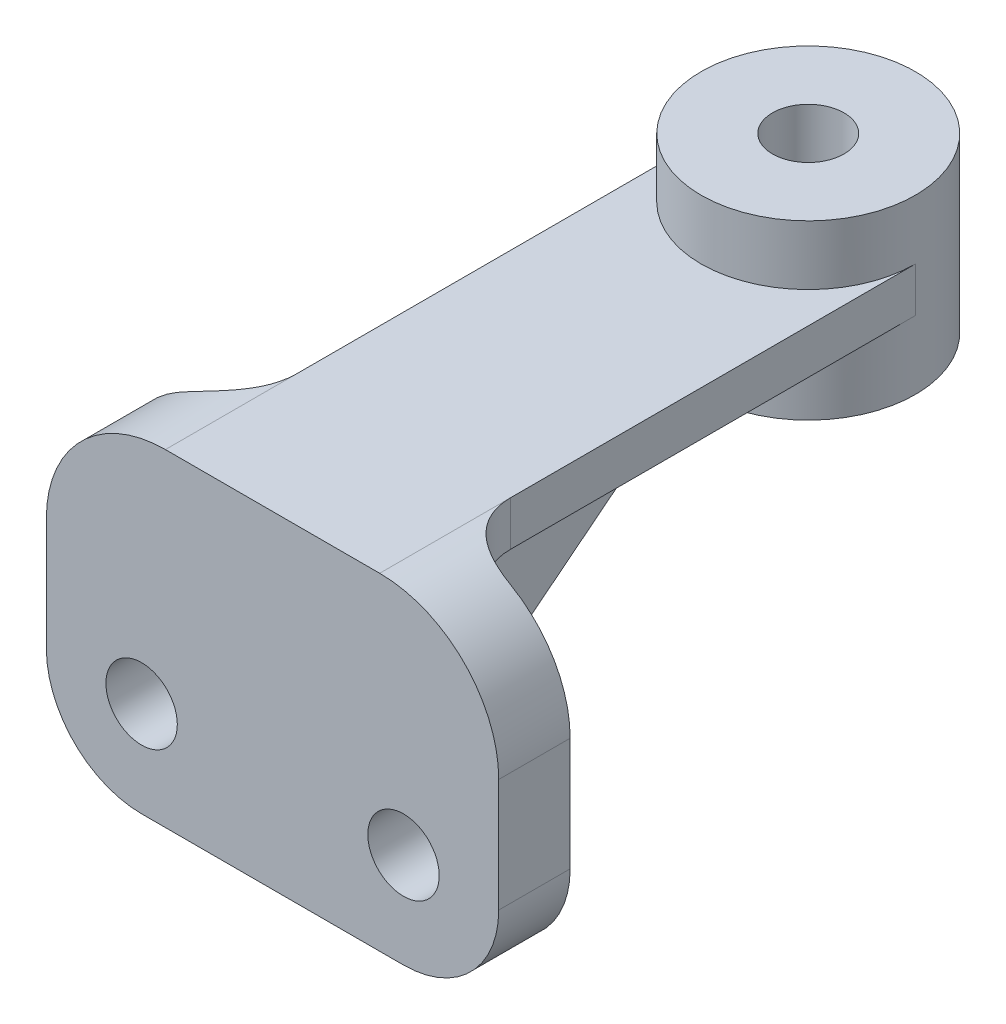
ISO-10303-21;
HEADER;
FILE_DESCRIPTION(('STEP AP214'),'2;1');
FILE_NAME('part.step','',(''),(''),'','','');
FILE_SCHEMA(('AUTOMOTIVE_DESIGN { 1 0 10303 214 1 1 1 1 }'));
ENDSEC;
DATA;
#1=APPLICATION_CONTEXT('core data for automotive mechanical design processes');
#2=APPLICATION_PROTOCOL_DEFINITION('international standard','automotive_design',2000,#1);
#3=PRODUCT_CONTEXT('',#1,'mechanical');
#4=PRODUCT('Part','Part','',(#3));
#5=PRODUCT_RELATED_PRODUCT_CATEGORY('part','',(#4));
#6=PRODUCT_DEFINITION_FORMATION('','',#4);
#7=PRODUCT_DEFINITION_CONTEXT('part definition',#1,'design');
#8=PRODUCT_DEFINITION('design','',#6,#7);
#9=PRODUCT_DEFINITION_SHAPE('','',#8);
#10=(LENGTH_UNIT() NAMED_UNIT(*) SI_UNIT(.MILLI.,.METRE.));
#11=(NAMED_UNIT(*) PLANE_ANGLE_UNIT() SI_UNIT($,.RADIAN.));
#12=(NAMED_UNIT(*) SI_UNIT($,.STERADIAN.) SOLID_ANGLE_UNIT());
#13=UNCERTAINTY_MEASURE_WITH_UNIT(LENGTH_MEASURE(1.E-05),#10,'distance_accuracy_value','');
#14=(GEOMETRIC_REPRESENTATION_CONTEXT(3) GLOBAL_UNCERTAINTY_ASSIGNED_CONTEXT((#13)) GLOBAL_UNIT_ASSIGNED_CONTEXT((#10,
#11,#12)) REPRESENTATION_CONTEXT('',''));
#15=CARTESIAN_POINT('',(0.,0.,0.));
#16=DIRECTION('',(0.,0.,1.));
#17=DIRECTION('',(1.,0.,0.));
#18=AXIS2_PLACEMENT_3D('',#15,#16,#17);
#19=CARTESIAN_POINT('',(0.,0.,-12.));
#20=DIRECTION('',(0.,0.,1.));
#21=DIRECTION('',(1.,0.,0.));
#22=AXIS2_PLACEMENT_3D('',#19,#20,#21);
#23=PLANE('',#22);
#24=CARTESIAN_POINT('',(-22.,-11.5,-12.));
#25=DIRECTION('',(0.,0.,1.));
#26=DIRECTION('',(1.,0.,0.));
#27=AXIS2_PLACEMENT_3D('',#24,#25,#26);
#28=CIRCLE('',#27,6.);
#29=CARTESIAN_POINT('',(-16.,-11.5,-12.));
#30=VERTEX_POINT('',#29);
#31=EDGE_CURVE('E221',#30,#30,#28,.T.);
#32=ORIENTED_EDGE('',*,*,#31,.T.);
#33=EDGE_LOOP('',(#32));
#34=FACE_BOUND('',#33,.T.);
#35=DIRECTION('',(0.,1.,0.));
#36=VECTOR('',#35,1.);
#37=CARTESIAN_POINT('',(-3.75,0.,-12.));
#38=LINE('',#37,#36);
#39=CARTESIAN_POINT('',(-3.75,-27.5,-12.));
#40=VERTEX_POINT('',#39);
#41=CARTESIAN_POINT('',(-3.75,20.,-12.));
#42=VERTEX_POINT('',#41);
#43=EDGE_CURVE('E67',#40,#42,#38,.T.);
#44=ORIENTED_EDGE('',*,*,#43,.F.);
#45=DIRECTION('',(1.,0.,0.));
#46=VECTOR('',#45,1.);
#47=CARTESIAN_POINT('',(0.,-27.5,-12.));
#48=LINE('',#47,#46);
#49=CARTESIAN_POINT('',(-21.9999999999999,-27.5,-12.));
#50=VERTEX_POINT('',#49);
#51=EDGE_CURVE('E191',#50,#40,#48,.T.);
#52=ORIENTED_EDGE('',*,*,#51,.F.);
#53=CARTESIAN_POINT('',(-22.,-11.5,-12.));
#54=DIRECTION('',(0.,0.,1.));
#55=DIRECTION('',(1.,0.,0.));
#56=AXIS2_PLACEMENT_3D('',#53,#54,#55);
#57=CIRCLE('',#56,16.);
#58=CARTESIAN_POINT('',(-38.,-11.4999999999999,-12.));
#59=VERTEX_POINT('',#58);
#60=EDGE_CURVE('E210',#50,#59,#57,.F.);
#61=ORIENTED_EDGE('',*,*,#60,.T.);
#62=DIRECTION('',(0.,-1.,0.));
#63=VECTOR('',#62,1.);
#64=CARTESIAN_POINT('',(-38.,0.,-12.));
#65=LINE('',#64,#63);
#66=CARTESIAN_POINT('',(-38.,7.5,-12.));
#67=VERTEX_POINT('',#66);
#68=EDGE_CURVE('E383',#67,#59,#65,.T.);
#69=ORIENTED_EDGE('',*,*,#68,.F.);
#70=CARTESIAN_POINT('',(-18.,7.5,-12.));
#71=DIRECTION('',(0.,0.,1.));
#72=DIRECTION('',(1.,0.,0.));
#73=AXIS2_PLACEMENT_3D('',#70,#71,#72);
#74=CIRCLE('',#73,20.);
#75=CARTESIAN_POINT('',(-28.,24.8205080756888,-12.));
#76=VERTEX_POINT('',#75);
#77=EDGE_CURVE('E386',#76,#67,#74,.T.);
#78=ORIENTED_EDGE('',*,*,#77,.F.);
#79=DIRECTION('',(0.,-1.,0.));
#80=VECTOR('',#79,1.);
#81=CARTESIAN_POINT('',(-28.,0.,-12.));
#82=LINE('',#81,#80);
#83=CARTESIAN_POINT('',(-28.,20.,-12.));
#84=VERTEX_POINT('',#83);
#85=EDGE_CURVE('E289',#76,#84,#82,.T.);
#86=ORIENTED_EDGE('',*,*,#85,.T.);
#87=DIRECTION('',(1.,0.,0.));
#88=VECTOR('',#87,1.);
#89=CARTESIAN_POINT('',(0.,20.,-12.));
#90=LINE('',#89,#88);
#91=EDGE_CURVE('E193',#84,#42,#90,.T.);
#92=ORIENTED_EDGE('',*,*,#91,.T.);
#93=EDGE_LOOP('',(#44,#52,#61,#69,#78,#86,#92));
#94=FACE_BOUND('',#93,.T.);
#95=ADVANCED_FACE('F45',(#34,#94),#23,.F.);
#96=CARTESIAN_POINT('',(0.,20.,-90.));
#97=DIRECTION('',(0.,-1.,0.));
#98=DIRECTION('',(1.,0.,0.));
#99=AXIS2_PLACEMENT_3D('',#96,#97,#98);
#100=PLANE('',#99);
#101=DIRECTION('',(0.,0.,1.));
#102=VECTOR('',#101,1.);
#103=CARTESIAN_POINT('',(3.75,20.,-90.));
#104=LINE('',#103,#102);
#105=CARTESIAN_POINT('',(3.75,20.,-72.));
#106=VERTEX_POINT('',#105);
#107=CARTESIAN_POINT('',(3.75,20.,-12.));
#108=VERTEX_POINT('',#107);
#109=EDGE_CURVE('E444',#106,#108,#104,.T.);
#110=ORIENTED_EDGE('',*,*,#109,.F.);
#111=DIRECTION('',(1.,0.,0.));
#112=VECTOR('',#111,1.);
#113=CARTESIAN_POINT('',(0.,20.,-72.));
#114=LINE('',#113,#112);
#115=CARTESIAN_POINT('',(0.,20.,-72.));
#116=VERTEX_POINT('',#115);
#117=EDGE_CURVE('E441',#116,#106,#114,.T.);
#118=ORIENTED_EDGE('',*,*,#117,.F.);
#119=CARTESIAN_POINT('',(0.,20.,-90.));
#120=DIRECTION('',(0.,-1.,0.));
#121=DIRECTION('',(1.,0.,0.));
#122=AXIS2_PLACEMENT_3D('',#119,#120,#121);
#123=CIRCLE('',#122,18.);
#124=CARTESIAN_POINT('',(18.,20.,-90.));
#125=VERTEX_POINT('',#124);
#126=EDGE_CURVE('E421',#125,#116,#123,.T.);
#127=ORIENTED_EDGE('',*,*,#126,.F.);
#128=DIRECTION('',(0.,0.,1.));
#129=VECTOR('',#128,1.);
#130=CARTESIAN_POINT('',(18.,20.,-90.));
#131=LINE('',#130,#129);
#132=CARTESIAN_POINT('',(18.,20.,-22.));
#133=VERTEX_POINT('',#132);
#134=EDGE_CURVE('E408',#125,#133,#131,.T.);
#135=ORIENTED_EDGE('',*,*,#134,.T.);
#136=CARTESIAN_POINT('',(28.,20.,-22.));
#137=DIRECTION('',(0.,-1.,0.));
#138=DIRECTION('',(1.,0.,0.));
#139=AXIS2_PLACEMENT_3D('',#136,#137,#138);
#140=CIRCLE('',#139,10.);
#141=CARTESIAN_POINT('',(28.,20.,-12.));
#142=VERTEX_POINT('',#141);
#143=EDGE_CURVE('E60',#133,#142,#140,.F.);
#144=ORIENTED_EDGE('',*,*,#143,.T.);
#145=EDGE_CURVE('E395',#108,#142,#90,.T.);
#146=ORIENTED_EDGE('',*,*,#145,.F.);
#147=EDGE_LOOP('',(#110,#118,#127,#135,#144,#146));
#148=FACE_BOUND('',#147,.T.);
#149=ADVANCED_FACE('F337',(#148),#100,.T.);
#150=CARTESIAN_POINT('',(22.,-11.5,-12.));
#151=DIRECTION('',(0.,0.,1.));
#152=DIRECTION('',(1.,0.,0.));
#153=AXIS2_PLACEMENT_3D('',#150,#151,#152);
#154=CIRCLE('',#153,6.);
#155=CARTESIAN_POINT('',(28.,-11.5,-12.));
#156=VERTEX_POINT('',#155);
#157=EDGE_CURVE('E217',#156,#156,#154,.T.);
#158=ORIENTED_EDGE('',*,*,#157,.T.);
#159=EDGE_LOOP('',(#158));
#160=FACE_BOUND('',#159,.T.);
#161=CARTESIAN_POINT('',(3.75,-27.5,-12.));
#162=VERTEX_POINT('',#161);
#163=CARTESIAN_POINT('',(21.9999999999999,-27.5,-12.));
#164=VERTEX_POINT('',#163);
#165=EDGE_CURVE('E203',#162,#164,#48,.T.);
#166=ORIENTED_EDGE('',*,*,#165,.F.);
#167=DIRECTION('',(0.,1.,0.));
#168=VECTOR('',#167,1.);
#169=CARTESIAN_POINT('',(3.75,0.,-12.));
#170=LINE('',#169,#168);
#171=EDGE_CURVE('E447',#162,#108,#170,.T.);
#172=ORIENTED_EDGE('',*,*,#171,.T.);
#173=ORIENTED_EDGE('',*,*,#145,.T.);
#174=DIRECTION('',(0.,-1.,0.));
#175=VECTOR('',#174,1.);
#176=CARTESIAN_POINT('',(28.,27.5,-12.));
#177=LINE('',#176,#175);
#178=CARTESIAN_POINT('',(28.,24.8205080756888,-12.));
#179=VERTEX_POINT('',#178);
#180=EDGE_CURVE('E267',#142,#179,#177,.F.);
#181=ORIENTED_EDGE('',*,*,#180,.T.);
#182=CARTESIAN_POINT('',(18.,7.5,-12.));
#183=DIRECTION('',(0.,0.,1.));
#184=DIRECTION('',(1.,0.,0.));
#185=AXIS2_PLACEMENT_3D('',#182,#183,#184);
#186=CIRCLE('',#185,20.);
#187=CARTESIAN_POINT('',(38.,7.5,-12.));
#188=VERTEX_POINT('',#187);
#189=EDGE_CURVE('E263',#179,#188,#186,.F.);
#190=ORIENTED_EDGE('',*,*,#189,.T.);
#191=DIRECTION('',(0.,1.,0.));
#192=VECTOR('',#191,1.);
#193=CARTESIAN_POINT('',(38.,0.,-12.));
#194=LINE('',#193,#192);
#195=CARTESIAN_POINT('',(38.,-11.4999999999999,-12.));
#196=VERTEX_POINT('',#195);
#197=EDGE_CURVE('E208',#196,#188,#194,.T.);
#198=ORIENTED_EDGE('',*,*,#197,.F.);
#199=CARTESIAN_POINT('',(22.,-11.5,-12.));
#200=DIRECTION('',(0.,0.,1.));
#201=DIRECTION('',(1.,0.,0.));
#202=AXIS2_PLACEMENT_3D('',#199,#200,#201);
#203=CIRCLE('',#202,16.);
#204=EDGE_CURVE('E202',#196,#164,#203,.F.);
#205=ORIENTED_EDGE('',*,*,#204,.T.);
#206=EDGE_LOOP('',(#166,#172,#173,#181,#190,#198,#205));
#207=FACE_BOUND('',#206,.T.);
#208=ADVANCED_FACE('F328',(#160,#207),#23,.F.);
#209=CARTESIAN_POINT('',(18.,7.5,-12.));
#210=DIRECTION('',(0.,0.,1.));
#211=DIRECTION('',(1.,0.,0.));
#212=AXIS2_PLACEMENT_3D('',#209,#210,#211);
#213=CYLINDRICAL_SURFACE('',#212,20.);
#214=CARTESIAN_POINT('',(18.,7.5,0.));
#215=DIRECTION('',(0.,0.,1.));
#216=DIRECTION('',(1.,0.,0.));
#217=AXIS2_PLACEMENT_3D('',#214,#215,#216);
#218=CIRCLE('',#217,20.);
#219=CARTESIAN_POINT('',(18.,27.5,0.));
#220=VERTEX_POINT('',#219);
#221=CARTESIAN_POINT('',(38.,7.5,0.));
#222=VERTEX_POINT('',#221);
#223=EDGE_CURVE('E225',#220,#222,#218,.F.);
#224=ORIENTED_EDGE('',*,*,#223,.T.);
#225=DIRECTION('',(0.,0.,1.));
#226=VECTOR('',#225,1.);
#227=CARTESIAN_POINT('',(38.,7.5,-12.));
#228=LINE('',#227,#226);
#229=EDGE_CURVE('E264',#188,#222,#228,.T.);
#230=ORIENTED_EDGE('',*,*,#229,.F.);
#231=ORIENTED_EDGE('',*,*,#189,.F.);
#232=CARTESIAN_POINT('',(28.,24.8205080756888,-12.));
#233=CARTESIAN_POINT('',(27.7591532554795,24.959612415594,-11.9999710171059));
#234=CARTESIAN_POINT('',(27.5152933361381,25.0936559303901,-12.0087017338027));
#235=CARTESIAN_POINT('',(27.0231554870416,25.3510321720107,-12.0447730549399));
#236=CARTESIAN_POINT('',(26.7748749277504,25.4743582486052,-12.0721251223594));
#237=CARTESIAN_POINT('',(26.2754673068157,25.7096966668275,-12.146582724708));
#238=CARTESIAN_POINT('',(26.0243368454064,25.8216934593926,-12.1937149627326));
#239=CARTESIAN_POINT('',(25.5217561394892,26.0336859705613,-12.3085233112928));
#240=CARTESIAN_POINT('',(25.2703059778284,26.133684333424,-12.3761948836464));
#241=CARTESIAN_POINT('',(24.76834212011,26.3218407710521,-12.5329097833715));
#242=CARTESIAN_POINT('',(24.5178365530495,26.4099483557128,-12.6220400312844));
#243=CARTESIAN_POINT('',(24.021319901884,26.5738581333725,-12.821672258192));
#244=CARTESIAN_POINT('',(23.7753091730089,26.6496593574932,-12.9321759184139));
#245=CARTESIAN_POINT('',(23.2907462541378,26.7891545861386,-13.1741203135333));
#246=CARTESIAN_POINT('',(23.0521832592977,26.85286688267,-13.3055288538357));
#247=CARTESIAN_POINT('',(22.5846355373681,26.9689275565784,-13.5887856776375));
#248=CARTESIAN_POINT('',(22.3556502245972,27.0212766296463,-13.7406327089079));
#249=CARTESIAN_POINT('',(21.9228000991912,27.1126912099352,-14.0542589469005));
#250=CARTESIAN_POINT('',(21.7182505287784,27.1523591542812,-14.2149199097358));
#251=CARTESIAN_POINT('',(21.3214911471556,27.2232936928387,-14.5524931735992));
#252=CARTESIAN_POINT('',(21.1292808962808,27.2545605865166,-14.7294048950463));
#253=CARTESIAN_POINT('',(20.75868119688,27.3097149968838,-15.0984256821562));
#254=CARTESIAN_POINT('',(20.5803001393103,27.3335980592366,-15.2905438337601));
#255=CARTESIAN_POINT('',(20.238881725186,27.3750343291867,-15.6885974872983));
#256=CARTESIAN_POINT('',(20.0758447209617,27.3925873914606,-15.8945333063282));
#257=CARTESIAN_POINT('',(19.7637826935027,27.4227019851648,-16.3223271928861));
#258=CARTESIAN_POINT('',(19.6150315693306,27.4351768619137,-16.544391116143));
#259=CARTESIAN_POINT('',(19.3357069275274,27.4558389477264,-16.9998601207297));
#260=CARTESIAN_POINT('',(19.2051337650832,27.4640260730185,-17.2332654235435));
#261=CARTESIAN_POINT('',(18.9630733629641,27.4771666714359,-17.7098497382941));
#262=CARTESIAN_POINT('',(18.8515858207446,27.4821201958237,-17.9530285952255));
#263=CARTESIAN_POINT('',(18.6484399764452,27.489743941604,-18.4475665270648));
#264=CARTESIAN_POINT('',(18.5567816546727,27.4924141652643,-18.6989255938485));
#265=CARTESIAN_POINT('',(18.3967555040126,27.4962189021077,-19.1992434462662));
#266=CARTESIAN_POINT('',(18.3276831892034,27.4974040220749,-19.4479768830272));
#267=CARTESIAN_POINT('',(18.2089734503378,27.4989958117031,-19.9500381938482));
#268=CARTESIAN_POINT('',(18.159335645266,27.4994024966261,-20.2033659777337));
#269=CARTESIAN_POINT('',(18.0797935346939,27.4998827127155,-20.7131320476637));
#270=CARTESIAN_POINT('',(18.0498916493838,27.4999562030292,-20.9695707112661));
#271=CARTESIAN_POINT('',(18.0099836654421,27.4999989843423,-21.4840051708444));
#272=CARTESIAN_POINT('',(17.9999786511699,27.4999682696628,-21.7420010509185));
#273=CARTESIAN_POINT('',(18.,27.5,-22.));
#274=B_SPLINE_CURVE_WITH_KNOTS('',3,(#232,#233,#234,#235,#236,#237,#238,#239,#240,#241,#242,
#243,#244,#245,#246,#247,#248,#249,#250,#251,#252,#253,#254,#255,#256,#257,#258,#259,#260,#261,
#262,#263,#264,#265,#266,#267,#268,#269,#270,#271,#272,#273),.UNSPECIFIED.,.F.,.F.,(4,2,2,2,2,2,
2,2,2,2,2,2,2,2,2,2,2,2,2,2,4),(0.,0.834312350280989,1.6691387536459,2.50509581083416,
3.34086829694701,4.18008487221364,5.01936748690844,5.85736985767486,6.69532090891779,
7.48372262446205,8.27209623268631,9.06094450777076,9.84981089198667,10.6516249580703,
11.4534546889452,12.2552717080681,13.0570879308976,13.8307645145586,14.6044259294532,
15.378182199828,16.1519806379827),.UNSPECIFIED.);
#275=CARTESIAN_POINT('',(18.,27.5,-22.));
#276=VERTEX_POINT('',#275);
#277=EDGE_CURVE('E11',#179,#276,#274,.T.);
#278=ORIENTED_EDGE('',*,*,#277,.T.);
#279=DIRECTION('',(0.,0.,1.));
#280=VECTOR('',#279,1.);
#281=CARTESIAN_POINT('',(18.,27.5,-12.));
#282=LINE('',#281,#280);
#283=EDGE_CURVE('E75',#276,#220,#282,.T.);
#284=ORIENTED_EDGE('',*,*,#283,.T.);
#285=EDGE_LOOP('',(#224,#230,#231,#278,#284));
#286=FACE_BOUND('',#285,.T.);
#287=ADVANCED_FACE('F324',(#286),#213,.T.);
#288=CARTESIAN_POINT('',(38.,0.,-12.));
#289=DIRECTION('',(1.,0.,0.));
#290=DIRECTION('',(0.,0.,-1.));
#291=AXIS2_PLACEMENT_3D('',#288,#289,#290);
#292=PLANE('',#291);
#293=DIRECTION('',(0.,1.,0.));
#294=VECTOR('',#293,1.);
#295=CARTESIAN_POINT('',(38.,0.,0.));
#296=LINE('',#295,#294);
#297=CARTESIAN_POINT('',(38.,-11.4999999999999,0.));
#298=VERTEX_POINT('',#297);
#299=EDGE_CURVE('E251',#298,#222,#296,.T.);
#300=ORIENTED_EDGE('',*,*,#299,.F.);
#301=DIRECTION('',(0.,0.,1.));
#302=VECTOR('',#301,1.);
#303=CARTESIAN_POINT('',(38.,-11.4999999999999,-12.));
#304=LINE('',#303,#302);
#305=EDGE_CURVE('E268',#196,#298,#304,.T.);
#306=ORIENTED_EDGE('',*,*,#305,.F.);
#307=ORIENTED_EDGE('',*,*,#197,.T.);
#308=ORIENTED_EDGE('',*,*,#229,.T.);
#309=EDGE_LOOP('',(#300,#306,#307,#308));
#310=FACE_BOUND('',#309,.T.);
#311=ADVANCED_FACE('F327',(#310),#292,.T.);
#312=CARTESIAN_POINT('',(22.,-11.5,-12.));
#313=DIRECTION('',(0.,0.,1.));
#314=DIRECTION('',(1.,0.,0.));
#315=AXIS2_PLACEMENT_3D('',#312,#313,#314);
#316=CYLINDRICAL_SURFACE('',#315,16.);
#317=CARTESIAN_POINT('',(22.,-11.5,0.));
#318=DIRECTION('',(0.,0.,1.));
#319=DIRECTION('',(1.,0.,0.));
#320=AXIS2_PLACEMENT_3D('',#317,#318,#319);
#321=CIRCLE('',#320,16.);
#322=CARTESIAN_POINT('',(21.9999999999999,-27.5,0.));
#323=VERTEX_POINT('',#322);
#324=EDGE_CURVE('E247',#298,#323,#321,.F.);
#325=ORIENTED_EDGE('',*,*,#324,.T.);
#326=DIRECTION('',(0.,0.,1.));
#327=VECTOR('',#326,1.);
#328=CARTESIAN_POINT('',(21.9999999999999,-27.5,-12.));
#329=LINE('',#328,#327);
#330=EDGE_CURVE('E271',#164,#323,#329,.T.);
#331=ORIENTED_EDGE('',*,*,#330,.F.);
#332=ORIENTED_EDGE('',*,*,#204,.F.);
#333=ORIENTED_EDGE('',*,*,#305,.T.);
#334=EDGE_LOOP('',(#325,#331,#332,#333));
#335=FACE_BOUND('',#334,.T.);
#336=ADVANCED_FACE('F334',(#335),#316,.T.);
#337=CARTESIAN_POINT('',(0.,-27.5,-12.));
#338=DIRECTION('',(0.,-1.,0.));
#339=DIRECTION('',(0.,0.,-1.));
#340=AXIS2_PLACEMENT_3D('',#337,#338,#339);
#341=PLANE('',#340);
#342=ORIENTED_EDGE('',*,*,#330,.T.);
#343=DIRECTION('',(1.,0.,0.));
#344=VECTOR('',#343,1.);
#345=CARTESIAN_POINT('',(0.,-27.5,0.));
#346=LINE('',#345,#344);
#347=CARTESIAN_POINT('',(-21.9999999999999,-27.5,0.));
#348=VERTEX_POINT('',#347);
#349=EDGE_CURVE('E244',#348,#323,#346,.T.);
#350=ORIENTED_EDGE('',*,*,#349,.F.);
#351=DIRECTION('',(0.,0.,1.));
#352=VECTOR('',#351,1.);
#353=CARTESIAN_POINT('',(-21.9999999999999,-27.5,-12.));
#354=LINE('',#353,#352);
#355=EDGE_CURVE('E199',#50,#348,#354,.T.);
#356=ORIENTED_EDGE('',*,*,#355,.F.);
#357=ORIENTED_EDGE('',*,*,#51,.T.);
#358=DIRECTION('',(1.,0.,0.));
#359=VECTOR('',#358,1.);
#360=CARTESIAN_POINT('',(0.,-27.5,-12.));
#361=LINE('',#360,#359);
#362=EDGE_CURVE('E171',#40,#162,#361,.T.);
#363=ORIENTED_EDGE('',*,*,#362,.T.);
#364=ORIENTED_EDGE('',*,*,#165,.T.);
#365=EDGE_LOOP('',(#342,#350,#356,#357,#363,#364));
#366=FACE_BOUND('',#365,.T.);
#367=ADVANCED_FACE('F197',(#366),#341,.T.);
#368=CARTESIAN_POINT('',(-22.,-11.5,-12.));
#369=DIRECTION('',(0.,0.,1.));
#370=DIRECTION('',(1.,0.,0.));
#371=AXIS2_PLACEMENT_3D('',#368,#369,#370);
#372=CYLINDRICAL_SURFACE('',#371,16.);
#373=CARTESIAN_POINT('',(-22.,-11.5,0.));
#374=DIRECTION('',(0.,0.,1.));
#375=DIRECTION('',(1.,0.,0.));
#376=AXIS2_PLACEMENT_3D('',#373,#374,#375);
#377=CIRCLE('',#376,16.);
#378=CARTESIAN_POINT('',(-38.,-11.4999999999999,0.));
#379=VERTEX_POINT('',#378);
#380=EDGE_CURVE('E240',#348,#379,#377,.F.);
#381=ORIENTED_EDGE('',*,*,#380,.T.);
#382=DIRECTION('',(0.,0.,1.));
#383=VECTOR('',#382,1.);
#384=CARTESIAN_POINT('',(-38.,-11.4999999999999,-12.));
#385=LINE('',#384,#383);
#386=EDGE_CURVE('E276',#59,#379,#385,.T.);
#387=ORIENTED_EDGE('',*,*,#386,.F.);
#388=ORIENTED_EDGE('',*,*,#60,.F.);
#389=ORIENTED_EDGE('',*,*,#355,.T.);
#390=EDGE_LOOP('',(#381,#387,#388,#389));
#391=FACE_BOUND('',#390,.T.);
#392=ADVANCED_FACE('F366',(#391),#372,.T.);
#393=CARTESIAN_POINT('',(-38.,0.,-12.));
#394=DIRECTION('',(-1.,0.,0.));
#395=DIRECTION('',(0.,0.,1.));
#396=AXIS2_PLACEMENT_3D('',#393,#394,#395);
#397=PLANE('',#396);
#398=DIRECTION('',(0.,-1.,0.));
#399=VECTOR('',#398,1.);
#400=CARTESIAN_POINT('',(-38.,0.,0.));
#401=LINE('',#400,#399);
#402=CARTESIAN_POINT('',(-38.,7.5,0.));
#403=VERTEX_POINT('',#402);
#404=EDGE_CURVE('E236',#403,#379,#401,.T.);
#405=ORIENTED_EDGE('',*,*,#404,.F.);
#406=DIRECTION('',(0.,0.,1.));
#407=VECTOR('',#406,1.);
#408=CARTESIAN_POINT('',(-38.,7.5,-12.));
#409=LINE('',#408,#407);
#410=EDGE_CURVE('E279',#67,#403,#409,.T.);
#411=ORIENTED_EDGE('',*,*,#410,.F.);
#412=ORIENTED_EDGE('',*,*,#68,.T.);
#413=ORIENTED_EDGE('',*,*,#386,.T.);
#414=EDGE_LOOP('',(#405,#411,#412,#413));
#415=FACE_BOUND('',#414,.T.);
#416=ADVANCED_FACE('F318',(#415),#397,.T.);
#417=CARTESIAN_POINT('',(-18.,7.5,-12.));
#418=DIRECTION('',(0.,0.,1.));
#419=DIRECTION('',(1.,0.,0.));
#420=AXIS2_PLACEMENT_3D('',#417,#418,#419);
#421=CYLINDRICAL_SURFACE('',#420,20.);
#422=CARTESIAN_POINT('',(-18.,7.5,0.));
#423=DIRECTION('',(0.,0.,1.));
#424=DIRECTION('',(1.,0.,0.));
#425=AXIS2_PLACEMENT_3D('',#422,#423,#424);
#426=CIRCLE('',#425,20.);
#427=CARTESIAN_POINT('',(-18.,27.5,0.));
#428=VERTEX_POINT('',#427);
#429=EDGE_CURVE('E232',#428,#403,#426,.T.);
#430=ORIENTED_EDGE('',*,*,#429,.F.);
#431=DIRECTION('',(0.,0.,1.));
#432=VECTOR('',#431,1.);
#433=CARTESIAN_POINT('',(-18.,27.5,-12.));
#434=LINE('',#433,#432);
#435=CARTESIAN_POINT('',(-18.,27.5,-22.));
#436=VERTEX_POINT('',#435);
#437=EDGE_CURVE('E282',#436,#428,#434,.T.);
#438=ORIENTED_EDGE('',*,*,#437,.F.);
#439=CARTESIAN_POINT('',(-18.,27.5,-22.));
#440=CARTESIAN_POINT('',(-17.9999700561421,27.4999557370953,-21.7194373626147));
#441=CARTESIAN_POINT('',(-18.011806057273,27.4999986078176,-21.4388789748108));
#442=CARTESIAN_POINT('',(-18.0589939019383,27.4999387337623,-20.8797567736334));
#443=CARTESIAN_POINT('',(-18.0943448639402,27.4998359944431,-20.6011928858855));
#444=CARTESIAN_POINT('',(-18.1883323555675,27.4991651639557,-20.0481083286231));
#445=CARTESIAN_POINT('',(-18.2469618184913,27.4985972139569,-19.7735864582701));
#446=CARTESIAN_POINT('',(-18.387080348756,27.4963773522755,-19.2304474469341));
#447=CARTESIAN_POINT('',(-18.4685691322177,27.4947254540536,-18.9618302326685));
#448=CARTESIAN_POINT('',(-18.6538867852617,27.489522603102,-18.4322383835197));
#449=CARTESIAN_POINT('',(-18.7577299842991,27.4859704300935,-18.1712687733254));
#450=CARTESIAN_POINT('',(-18.9869687816705,27.4759617833958,-17.6590325262998));
#451=CARTESIAN_POINT('',(-19.1123640439494,27.4695053549892,-17.4077657382501));
#452=CARTESIAN_POINT('',(-19.3837562084746,27.4525359716774,-16.9167914406746));
#453=CARTESIAN_POINT('',(-19.5297507287383,27.4420234855485,-16.6770825989467));
#454=CARTESIAN_POINT('',(-19.8412156215723,27.4156807366992,-16.2109760820179));
#455=CARTESIAN_POINT('',(-20.0066856504917,27.3998505678017,-15.9845781720474));
#456=CARTESIAN_POINT('',(-20.3539611509374,27.3617485317303,-15.5490414488138));
#457=CARTESIAN_POINT('',(-20.535582345704,27.3395441677449,-15.3397498653632));
#458=CARTESIAN_POINT('',(-20.9150291104792,27.2873511781658,-14.9374481976744));
#459=CARTESIAN_POINT('',(-21.1128546186486,27.2573625822775,-14.7444380513082));
#460=CARTESIAN_POINT('',(-21.5227650457001,27.1884046394683,-14.3762696843768));
#461=CARTESIAN_POINT('',(-21.7348395091209,27.1494418276717,-14.2010986064214));
#462=CARTESIAN_POINT('',(-22.1713345483275,27.0614292641474,-13.8697026041787));
#463=CARTESIAN_POINT('',(-22.3957545373687,27.0123799914951,-13.713476780611));
#464=CARTESIAN_POINT('',(-22.8452651922289,26.9055291021525,-13.4269719955017));
#465=CARTESIAN_POINT('',(-23.0699504253168,26.8481692420369,-13.2958913568552));
#466=CARTESIAN_POINT('',(-23.5264776970641,26.7227487020385,-13.052682753355));
#467=CARTESIAN_POINT('',(-23.7583196852383,26.654688097627,-12.9405546548422));
#468=CARTESIAN_POINT('',(-24.2271936535869,26.507432782435,-12.7354718775947));
#469=CARTESIAN_POINT('',(-24.4642307154973,26.4282267177046,-12.6425369923577));
#470=CARTESIAN_POINT('',(-24.9410456987822,26.2586219733123,-12.4760006482549));
#471=CARTESIAN_POINT('',(-25.1808233876556,26.1682242367918,-12.402397561895));
#472=CARTESIAN_POINT('',(-25.6387014476788,25.9852716379337,-12.2801697438194));
#473=CARTESIAN_POINT('',(-25.8567473597242,25.8936964321844,-12.2298602907129));
#474=CARTESIAN_POINT('',(-26.2919186388049,25.7016664772038,-12.1444619779872));
#475=CARTESIAN_POINT('',(-26.5090439481614,25.601211179975,-12.1093740584913));
#476=CARTESIAN_POINT('',(-26.9405683262043,25.3919969567306,-12.0539043702059));
#477=CARTESIAN_POINT('',(-27.1549721532543,25.2832558670354,-12.0334919471719));
#478=CARTESIAN_POINT('',(-27.5803302086068,25.0577747522793,-12.0065346092507));
#479=CARTESIAN_POINT('',(-27.7912856214477,24.9410375485944,-11.9999848287779));
#480=CARTESIAN_POINT('',(-28.,24.8205080756888,-12.));
#481=B_SPLINE_CURVE_WITH_KNOTS('',3,(#439,#440,#441,#442,#443,#444,#445,#446,#447,#448,#449,
#450,#451,#452,#453,#454,#455,#456,#457,#458,#459,#460,#461,#462,#463,#464,#465,#466,#467,#468,
#469,#470,#471,#472,#473,#474,#475,#476,#477,#478,#479,#480),.UNSPECIFIED.,.F.,.F.,(4,2,2,2,2,2,
2,2,2,2,2,2,2,2,2,2,2,2,2,2,4),(0.,0.841432372616268,1.68283320326807,2.5239788032209,
3.36511395784561,4.20678990454418,5.04845272842231,5.89001830677084,6.73156903767482,
7.56451718005766,8.39746214387059,9.22980245490532,10.0621032415009,10.8602498176647,
11.6583907648246,12.4573507499772,13.2562434511754,13.9809573838289,14.7057160704186,
15.4289564442854,16.1519429291931),.UNSPECIFIED.);
#482=EDGE_CURVE('E303',#436,#76,#481,.T.);
#483=ORIENTED_EDGE('',*,*,#482,.T.);
#484=ORIENTED_EDGE('',*,*,#77,.T.);
#485=ORIENTED_EDGE('',*,*,#410,.T.);
#486=EDGE_LOOP('',(#430,#438,#483,#484,#485));
#487=FACE_BOUND('',#486,.T.);
#488=ADVANCED_FACE('F312',(#487),#421,.T.);
#489=CARTESIAN_POINT('',(22.,-11.5,-12.));
#490=DIRECTION('',(0.,0.,1.));
#491=DIRECTION('',(1.,0.,0.));
#492=AXIS2_PLACEMENT_3D('',#489,#490,#491);
#493=CYLINDRICAL_SURFACE('',#492,6.);
#494=ORIENTED_EDGE('',*,*,#157,.F.);
#495=EDGE_LOOP('',(#494));
#496=FACE_BOUND('',#495,.T.);
#497=CARTESIAN_POINT('',(22.,-11.5,0.));
#498=DIRECTION('',(0.,0.,1.));
#499=DIRECTION('',(1.,0.,0.));
#500=AXIS2_PLACEMENT_3D('',#497,#498,#499);
#501=CIRCLE('',#500,6.);
#502=CARTESIAN_POINT('',(28.,-11.5,0.));
#503=VERTEX_POINT('',#502);
#504=EDGE_CURVE('E255',#503,#503,#501,.T.);
#505=ORIENTED_EDGE('',*,*,#504,.T.);
#506=EDGE_LOOP('',(#505));
#507=FACE_BOUND('',#506,.T.);
#508=ADVANCED_FACE('F317',(#496,#507),#493,.F.);
#509=CARTESIAN_POINT('',(0.,27.5,-12.));
#510=DIRECTION('',(0.,-1.,0.));
#511=DIRECTION('',(0.,0.,-1.));
#512=AXIS2_PLACEMENT_3D('',#509,#510,#511);
#513=PLANE('',#512);
#514=CARTESIAN_POINT('',(0.,27.5,-90.));
#515=DIRECTION('',(0.,-1.,0.));
#516=DIRECTION('',(0.,0.,-1.));
#517=AXIS2_PLACEMENT_3D('',#514,#515,#516);
#518=CIRCLE('',#517,18.);
#519=CARTESIAN_POINT('',(18.,27.5,-90.));
#520=VERTEX_POINT('',#519);
#521=CARTESIAN_POINT('',(-18.,27.5,-90.));
#522=VERTEX_POINT('',#521);
#523=EDGE_CURVE('E418',#520,#522,#518,.T.);
#524=ORIENTED_EDGE('',*,*,#523,.T.);
#525=DIRECTION('',(0.,0.,1.));
#526=VECTOR('',#525,1.);
#527=CARTESIAN_POINT('',(-18.,27.5,-90.));
#528=LINE('',#527,#526);
#529=EDGE_CURVE('E399',#522,#436,#528,.T.);
#530=ORIENTED_EDGE('',*,*,#529,.T.);
#531=ORIENTED_EDGE('',*,*,#437,.T.);
#532=DIRECTION('',(1.,0.,0.));
#533=VECTOR('',#532,1.);
#534=CARTESIAN_POINT('',(0.,27.5,0.));
#535=LINE('',#534,#533);
#536=EDGE_CURVE('E229',#428,#220,#535,.T.);
#537=ORIENTED_EDGE('',*,*,#536,.T.);
#538=ORIENTED_EDGE('',*,*,#283,.F.);
#539=DIRECTION('',(0.,0.,1.));
#540=VECTOR('',#539,1.);
#541=CARTESIAN_POINT('',(18.,27.5,-90.));
#542=LINE('',#541,#540);
#543=EDGE_CURVE('E396',#520,#276,#542,.T.);
#544=ORIENTED_EDGE('',*,*,#543,.F.);
#545=EDGE_LOOP('',(#524,#530,#531,#537,#538,#544));
#546=FACE_BOUND('',#545,.T.);
#547=ADVANCED_FACE('F321',(#546),#513,.F.);
#548=CARTESIAN_POINT('',(-22.,-11.5,-12.));
#549=DIRECTION('',(0.,0.,1.));
#550=DIRECTION('',(1.,0.,0.));
#551=AXIS2_PLACEMENT_3D('',#548,#549,#550);
#552=CYLINDRICAL_SURFACE('',#551,6.);
#553=ORIENTED_EDGE('',*,*,#31,.F.);
#554=EDGE_LOOP('',(#553));
#555=FACE_BOUND('',#554,.T.);
#556=CARTESIAN_POINT('',(-22.,-11.5,0.));
#557=DIRECTION('',(0.,0.,1.));
#558=DIRECTION('',(1.,0.,0.));
#559=AXIS2_PLACEMENT_3D('',#556,#557,#558);
#560=CIRCLE('',#559,6.);
#561=CARTESIAN_POINT('',(-16.,-11.5,0.));
#562=VERTEX_POINT('',#561);
#563=EDGE_CURVE('E259',#562,#562,#560,.T.);
#564=ORIENTED_EDGE('',*,*,#563,.T.);
#565=EDGE_LOOP('',(#564));
#566=FACE_BOUND('',#565,.T.);
#567=ADVANCED_FACE('F323',(#555,#566),#552,.F.);
#568=CARTESIAN_POINT('',(0.,0.,0.));
#569=DIRECTION('',(0.,0.,1.));
#570=DIRECTION('',(1.,0.,0.));
#571=AXIS2_PLACEMENT_3D('',#568,#569,#570);
#572=PLANE('',#571);
#573=ORIENTED_EDGE('',*,*,#223,.F.);
#574=ORIENTED_EDGE('',*,*,#536,.F.);
#575=ORIENTED_EDGE('',*,*,#429,.T.);
#576=ORIENTED_EDGE('',*,*,#404,.T.);
#577=ORIENTED_EDGE('',*,*,#380,.F.);
#578=ORIENTED_EDGE('',*,*,#349,.T.);
#579=ORIENTED_EDGE('',*,*,#324,.F.);
#580=ORIENTED_EDGE('',*,*,#299,.T.);
#581=EDGE_LOOP('',(#573,#574,#575,#576,#577,#578,#579,#580));
#582=FACE_BOUND('',#581,.T.);
#583=ORIENTED_EDGE('',*,*,#504,.F.);
#584=EDGE_LOOP('',(#583));
#585=FACE_BOUND('',#584,.T.);
#586=ORIENTED_EDGE('',*,*,#563,.F.);
#587=EDGE_LOOP('',(#586));
#588=FACE_BOUND('',#587,.T.);
#589=ADVANCED_FACE('F352',(#582,#585,#588),#572,.T.);
#590=CARTESIAN_POINT('',(18.,0.,-90.));
#591=DIRECTION('',(-1.,0.,0.));
#592=DIRECTION('',(0.,-1.,0.));
#593=AXIS2_PLACEMENT_3D('',#590,#591,#592);
#594=PLANE('',#593);
#595=ORIENTED_EDGE('',*,*,#543,.T.);
#596=DIRECTION('',(0.,-1.,0.));
#597=VECTOR('',#596,1.);
#598=CARTESIAN_POINT('',(18.,20.,-22.));
#599=LINE('',#598,#597);
#600=EDGE_CURVE('E296',#276,#133,#599,.T.);
#601=ORIENTED_EDGE('',*,*,#600,.T.);
#602=ORIENTED_EDGE('',*,*,#134,.F.);
#603=DIRECTION('',(0.,-1.,0.));
#604=VECTOR('',#603,1.);
#605=CARTESIAN_POINT('',(18.,0.,-90.));
#606=LINE('',#605,#604);
#607=EDGE_CURVE('E415',#520,#125,#606,.T.);
#608=ORIENTED_EDGE('',*,*,#607,.F.);
#609=EDGE_LOOP('',(#595,#601,#602,#608));
#610=FACE_BOUND('',#609,.T.);
#611=ADVANCED_FACE('F350',(#610),#594,.F.);
#612=CARTESIAN_POINT('',(-3.75,20.,-72.));
#613=VERTEX_POINT('',#612);
#614=EDGE_CURVE('E182',#613,#116,#114,.T.);
#615=ORIENTED_EDGE('',*,*,#614,.F.);
#616=DIRECTION('',(0.,0.,1.));
#617=VECTOR('',#616,1.);
#618=CARTESIAN_POINT('',(-3.75,20.,-90.));
#619=LINE('',#618,#617);
#620=EDGE_CURVE('E185',#613,#42,#619,.T.);
#621=ORIENTED_EDGE('',*,*,#620,.T.);
#622=ORIENTED_EDGE('',*,*,#91,.F.);
#623=CARTESIAN_POINT('',(-28.,20.,-22.));
#624=DIRECTION('',(0.,-1.,0.));
#625=DIRECTION('',(1.,0.,0.));
#626=AXIS2_PLACEMENT_3D('',#623,#624,#625);
#627=CIRCLE('',#626,10.);
#628=CARTESIAN_POINT('',(-18.,20.,-22.));
#629=VERTEX_POINT('',#628);
#630=EDGE_CURVE('E300',#84,#629,#627,.F.);
#631=ORIENTED_EDGE('',*,*,#630,.T.);
#632=DIRECTION('',(0.,0.,1.));
#633=VECTOR('',#632,1.);
#634=CARTESIAN_POINT('',(-18.,20.,-90.));
#635=LINE('',#634,#633);
#636=CARTESIAN_POINT('',(-18.,20.,-90.));
#637=VERTEX_POINT('',#636);
#638=EDGE_CURVE('E404',#637,#629,#635,.T.);
#639=ORIENTED_EDGE('',*,*,#638,.F.);
#640=EDGE_CURVE('E425',#116,#637,#123,.T.);
#641=ORIENTED_EDGE('',*,*,#640,.F.);
#642=EDGE_LOOP('',(#615,#621,#622,#631,#639,#641));
#643=FACE_BOUND('',#642,.T.);
#644=ADVANCED_FACE('F347',(#643),#100,.T.);
#645=CARTESIAN_POINT('',(-18.,0.,-90.));
#646=DIRECTION('',(-1.,0.,0.));
#647=DIRECTION('',(0.,0.,1.));
#648=AXIS2_PLACEMENT_3D('',#645,#646,#647);
#649=PLANE('',#648);
#650=ORIENTED_EDGE('',*,*,#638,.T.);
#651=DIRECTION('',(0.,-1.,0.));
#652=VECTOR('',#651,1.);
#653=CARTESIAN_POINT('',(-18.,0.,-22.));
#654=LINE('',#653,#652);
#655=EDGE_CURVE('E292',#629,#436,#654,.F.);
#656=ORIENTED_EDGE('',*,*,#655,.T.);
#657=ORIENTED_EDGE('',*,*,#529,.F.);
#658=DIRECTION('',(0.,-1.,0.));
#659=VECTOR('',#658,1.);
#660=CARTESIAN_POINT('',(-18.,0.,-90.));
#661=LINE('',#660,#659);
#662=EDGE_CURVE('E400',#522,#637,#661,.T.);
#663=ORIENTED_EDGE('',*,*,#662,.T.);
#664=EDGE_LOOP('',(#650,#656,#657,#663));
#665=FACE_BOUND('',#664,.T.);
#666=ADVANCED_FACE('F493',(#665),#649,.T.);
#667=CARTESIAN_POINT('',(0.,8.5,-90.));
#668=DIRECTION('',(0.,1.,0.));
#669=DIRECTION('',(0.,0.,1.));
#670=AXIS2_PLACEMENT_3D('',#667,#668,#669);
#671=CYLINDRICAL_SURFACE('',#670,18.);
#672=CARTESIAN_POINT('',(0.,37.5,-90.));
#673=DIRECTION('',(0.,1.,0.));
#674=DIRECTION('',(0.,0.,1.));
#675=AXIS2_PLACEMENT_3D('',#672,#673,#674);
#676=CIRCLE('',#675,18.);
#677=CARTESIAN_POINT('',(0.,37.5,-72.));
#678=VERTEX_POINT('',#677);
#679=EDGE_CURVE('E434',#678,#678,#676,.T.);
#680=ORIENTED_EDGE('',*,*,#679,.F.);
#681=EDGE_LOOP('',(#680));
#682=FACE_BOUND('',#681,.T.);
#683=ORIENTED_EDGE('',*,*,#662,.F.);
#684=ORIENTED_EDGE('',*,*,#523,.F.);
#685=ORIENTED_EDGE('',*,*,#607,.T.);
#686=ORIENTED_EDGE('',*,*,#126,.T.);
#687=ORIENTED_EDGE('',*,*,#640,.T.);
#688=EDGE_LOOP('',(#683,#684,#685,#686,#687));
#689=FACE_BOUND('',#688,.T.);
#690=CARTESIAN_POINT('',(0.,8.5,-90.));
#691=DIRECTION('',(0.,1.,0.));
#692=DIRECTION('',(0.,0.,1.));
#693=AXIS2_PLACEMENT_3D('',#690,#691,#692);
#694=CIRCLE('',#693,18.);
#695=CARTESIAN_POINT('',(0.,8.5,-72.));
#696=VERTEX_POINT('',#695);
#697=EDGE_CURVE('E426',#696,#696,#694,.T.);
#698=ORIENTED_EDGE('',*,*,#697,.T.);
#699=EDGE_LOOP('',(#698));
#700=FACE_BOUND('',#699,.T.);
#701=ADVANCED_FACE('F471',(#682,#689,#700),#671,.T.);
#702=CARTESIAN_POINT('',(0.,8.5,-90.));
#703=DIRECTION('',(0.,1.,0.));
#704=DIRECTION('',(0.,0.,1.));
#705=AXIS2_PLACEMENT_3D('',#702,#703,#704);
#706=CYLINDRICAL_SURFACE('',#705,6.);
#707=CARTESIAN_POINT('',(0.,37.5,-90.));
#708=DIRECTION('',(0.,1.,0.));
#709=DIRECTION('',(0.,0.,1.));
#710=AXIS2_PLACEMENT_3D('',#707,#708,#709);
#711=CIRCLE('',#710,6.);
#712=CARTESIAN_POINT('',(0.,37.5,-84.));
#713=VERTEX_POINT('',#712);
#714=EDGE_CURVE('E181',#713,#713,#711,.T.);
#715=ORIENTED_EDGE('',*,*,#714,.T.);
#716=EDGE_LOOP('',(#715));
#717=FACE_BOUND('',#716,.T.);
#718=CARTESIAN_POINT('',(0.,8.5,-90.));
#719=DIRECTION('',(0.,1.,0.));
#720=DIRECTION('',(0.,0.,1.));
#721=AXIS2_PLACEMENT_3D('',#718,#719,#720);
#722=CIRCLE('',#721,6.);
#723=CARTESIAN_POINT('',(0.,8.5,-84.));
#724=VERTEX_POINT('',#723);
#725=EDGE_CURVE('E430',#724,#724,#722,.T.);
#726=ORIENTED_EDGE('',*,*,#725,.F.);
#727=EDGE_LOOP('',(#726));
#728=FACE_BOUND('',#727,.T.);
#729=ADVANCED_FACE('F500',(#717,#728),#706,.F.);
#730=CARTESIAN_POINT('',(0.,8.5,-90.));
#731=DIRECTION('',(0.,1.,0.));
#732=DIRECTION('',(0.,0.,1.));
#733=AXIS2_PLACEMENT_3D('',#730,#731,#732);
#734=PLANE('',#733);
#735=ORIENTED_EDGE('',*,*,#725,.T.);
#736=EDGE_LOOP('',(#735));
#737=FACE_BOUND('',#736,.T.);
#738=ORIENTED_EDGE('',*,*,#697,.F.);
#739=EDGE_LOOP('',(#738));
#740=FACE_BOUND('',#739,.T.);
#741=ADVANCED_FACE('F504',(#737,#740),#734,.F.);
#742=CARTESIAN_POINT('',(0.,37.5,-90.));
#743=DIRECTION('',(0.,1.,0.));
#744=DIRECTION('',(0.,0.,1.));
#745=AXIS2_PLACEMENT_3D('',#742,#743,#744);
#746=PLANE('',#745);
#747=ORIENTED_EDGE('',*,*,#714,.F.);
#748=EDGE_LOOP('',(#747));
#749=FACE_BOUND('',#748,.T.);
#750=ORIENTED_EDGE('',*,*,#679,.T.);
#751=EDGE_LOOP('',(#750));
#752=FACE_BOUND('',#751,.T.);
#753=ADVANCED_FACE('F507',(#749,#752),#746,.T.);
#754=CARTESIAN_POINT('',(-28.,0.,-22.));
#755=DIRECTION('',(0.,-1.,0.));
#756=DIRECTION('',(0.,0.,-1.));
#757=AXIS2_PLACEMENT_3D('',#754,#755,#756);
#758=CYLINDRICAL_SURFACE('',#757,10.);
#759=ORIENTED_EDGE('',*,*,#482,.F.);
#760=ORIENTED_EDGE('',*,*,#655,.F.);
#761=ORIENTED_EDGE('',*,*,#630,.F.);
#762=ORIENTED_EDGE('',*,*,#85,.F.);
#763=EDGE_LOOP('',(#759,#760,#761,#762));
#764=FACE_BOUND('',#763,.T.);
#765=ADVANCED_FACE('F310',(#764),#758,.F.);
#766=CARTESIAN_POINT('',(28.,0.,-22.));
#767=DIRECTION('',(0.,1.,0.));
#768=DIRECTION('',(-1.,0.,0.));
#769=AXIS2_PLACEMENT_3D('',#766,#767,#768);
#770=CYLINDRICAL_SURFACE('',#769,10.);
#771=ORIENTED_EDGE('',*,*,#277,.F.);
#772=ORIENTED_EDGE('',*,*,#180,.F.);
#773=ORIENTED_EDGE('',*,*,#143,.F.);
#774=ORIENTED_EDGE('',*,*,#600,.F.);
#775=EDGE_LOOP('',(#771,#772,#773,#774));
#776=FACE_BOUND('',#775,.T.);
#777=ADVANCED_FACE('F47',(#776),#770,.F.);
#778=CARTESIAN_POINT('',(0.,-27.5,-12.));
#779=DIRECTION('',(0.,-0.784045824461762,-0.620702944365561));
#780=DIRECTION('',(0.,0.620702944365561,-0.784045824461761));
#781=AXIS2_PLACEMENT_3D('',#778,#779,#780);
#782=PLANE('',#781);
#783=ORIENTED_EDGE('',*,*,#362,.F.);
#784=DIRECTION('',(0.,0.620702944365561,-0.784045824461761));
#785=VECTOR('',#784,1.);
#786=CARTESIAN_POINT('',(-3.75,-27.5,-12.));
#787=LINE('',#786,#785);
#788=EDGE_CURVE('E173',#40,#613,#787,.T.);
#789=ORIENTED_EDGE('',*,*,#788,.T.);
#790=ORIENTED_EDGE('',*,*,#614,.T.);
#791=ORIENTED_EDGE('',*,*,#117,.T.);
#792=DIRECTION('',(0.,0.620702944365561,-0.784045824461761));
#793=VECTOR('',#792,1.);
#794=CARTESIAN_POINT('',(3.75,-27.5,-12.));
#795=LINE('',#794,#793);
#796=EDGE_CURVE('E176',#162,#106,#795,.T.);
#797=ORIENTED_EDGE('',*,*,#796,.F.);
#798=EDGE_LOOP('',(#783,#789,#790,#791,#797));
#799=FACE_BOUND('',#798,.T.);
#800=ADVANCED_FACE('F172',(#799),#782,.T.);
#801=CARTESIAN_POINT('',(3.75,5.,-54.));
#802=DIRECTION('',(1.,0.,0.));
#803=DIRECTION('',(0.,0.,-1.));
#804=AXIS2_PLACEMENT_3D('',#801,#802,#803);
#805=PLANE('',#804);
#806=ORIENTED_EDGE('',*,*,#796,.T.);
#807=ORIENTED_EDGE('',*,*,#109,.T.);
#808=ORIENTED_EDGE('',*,*,#171,.F.);
#809=EDGE_LOOP('',(#806,#807,#808));
#810=FACE_BOUND('',#809,.T.);
#811=ADVANCED_FACE('F456',(#810),#805,.T.);
#812=CARTESIAN_POINT('',(-3.75,5.,-54.));
#813=DIRECTION('',(1.,0.,0.));
#814=DIRECTION('',(0.,0.,-1.));
#815=AXIS2_PLACEMENT_3D('',#812,#813,#814);
#816=PLANE('',#815);
#817=ORIENTED_EDGE('',*,*,#620,.F.);
#818=ORIENTED_EDGE('',*,*,#788,.F.);
#819=ORIENTED_EDGE('',*,*,#43,.T.);
#820=EDGE_LOOP('',(#817,#818,#819));
#821=FACE_BOUND('',#820,.T.);
#822=ADVANCED_FACE('F184',(#821),#816,.F.);
#823=CLOSED_SHELL('',(#95,#149,#208,#287,#311,#336,#367,#392,#416,#488,#508,#547,#567,#589,#611,
#644,#666,#701,#729,#741,#753,#765,#777,#800,#811,#822));
#824=MANIFOLD_SOLID_BREP('B2',#823);
#825=ADVANCED_BREP_SHAPE_REPRESENTATION('',(#18,#824),#14);
#826=SHAPE_DEFINITION_REPRESENTATION(#9,#825);
ENDSEC;
END-ISO-10303-21;
